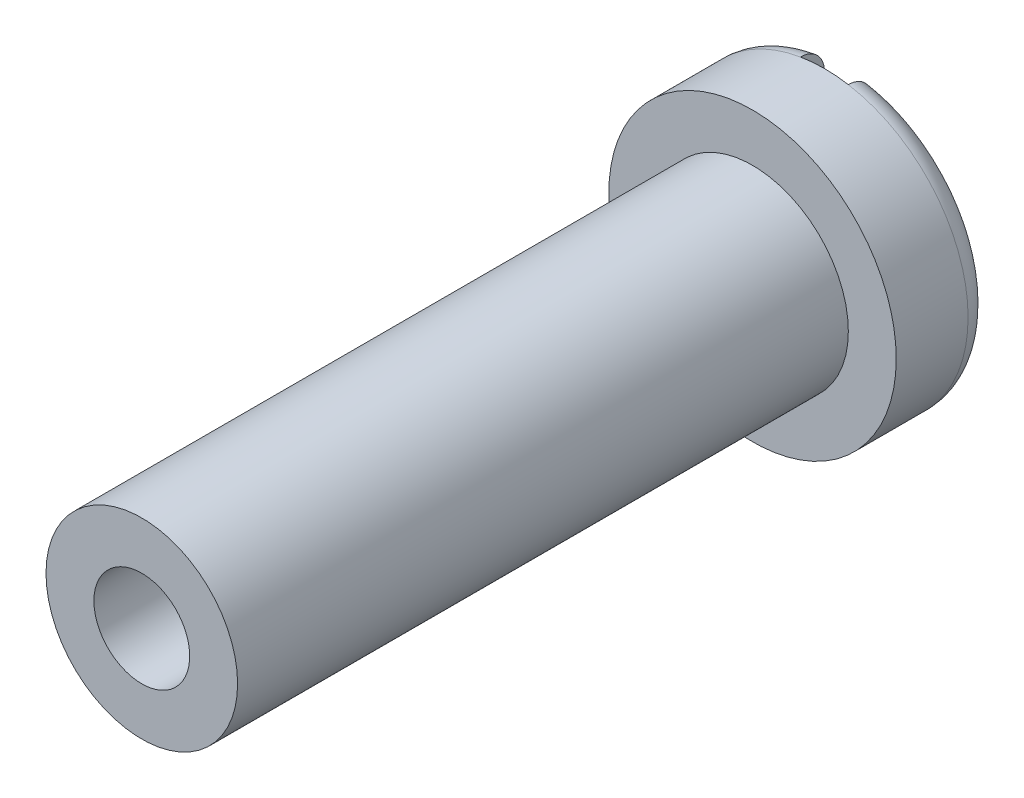
ISO-10303-21;
HEADER;
FILE_DESCRIPTION(('STEP AP214'),'2;1');
FILE_NAME('part.step','',(''),(''),'','','');
FILE_SCHEMA(('AUTOMOTIVE_DESIGN { 1 0 10303 214 1 1 1 1 }'));
ENDSEC;
DATA;
#1=APPLICATION_CONTEXT('core data for automotive mechanical design processes');
#2=APPLICATION_PROTOCOL_DEFINITION('international standard','automotive_design',2000,#1);
#3=PRODUCT_CONTEXT('',#1,'mechanical');
#4=PRODUCT('Part','Part','',(#3));
#5=PRODUCT_RELATED_PRODUCT_CATEGORY('part','',(#4));
#6=PRODUCT_DEFINITION_FORMATION('','',#4);
#7=PRODUCT_DEFINITION_CONTEXT('part definition',#1,'design');
#8=PRODUCT_DEFINITION('design','',#6,#7);
#9=PRODUCT_DEFINITION_SHAPE('','',#8);
#10=(LENGTH_UNIT() NAMED_UNIT(*) SI_UNIT(.MILLI.,.METRE.));
#11=(NAMED_UNIT(*) PLANE_ANGLE_UNIT() SI_UNIT($,.RADIAN.));
#12=(NAMED_UNIT(*) SI_UNIT($,.STERADIAN.) SOLID_ANGLE_UNIT());
#13=UNCERTAINTY_MEASURE_WITH_UNIT(LENGTH_MEASURE(1.E-05),#10,'distance_accuracy_value','');
#14=(GEOMETRIC_REPRESENTATION_CONTEXT(3) GLOBAL_UNCERTAINTY_ASSIGNED_CONTEXT((#13)) GLOBAL_UNIT_ASSIGNED_CONTEXT((#10,
#11,#12)) REPRESENTATION_CONTEXT('',''));
#15=CARTESIAN_POINT('',(0.,0.,0.));
#16=DIRECTION('',(0.,0.,1.));
#17=DIRECTION('',(1.,0.,0.));
#18=AXIS2_PLACEMENT_3D('',#15,#16,#17);
#19=CARTESIAN_POINT('',(0.,0.,0.));
#20=DIRECTION('',(0.,0.,1.));
#21=DIRECTION('',(1.,0.,0.));
#22=AXIS2_PLACEMENT_3D('',#19,#20,#21);
#23=PLANE('',#22);
#24=CARTESIAN_POINT('',(0.,0.,0.));
#25=DIRECTION('',(0.,0.,1.));
#26=DIRECTION('',(1.,0.,0.));
#27=AXIS2_PLACEMENT_3D('',#24,#25,#26);
#28=CIRCLE('',#27,2.5);
#29=CARTESIAN_POINT('',(-0.5,-2.44948974278318,0.));
#30=VERTEX_POINT('',#29);
#31=CARTESIAN_POINT('',(-0.5,2.44948974278318,0.));
#32=VERTEX_POINT('',#31);
#33=EDGE_CURVE('E116',#30,#32,#28,.F.);
#34=ORIENTED_EDGE('',*,*,#33,.T.);
#35=DIRECTION('',(0.,1.,0.));
#36=VECTOR('',#35,1.);
#37=CARTESIAN_POINT('',(-0.5,-3.,0.));
#38=LINE('',#37,#36);
#39=CARTESIAN_POINT('',(-0.5,0.866025403784439,0.));
#40=VERTEX_POINT('',#39);
#41=EDGE_CURVE('E120',#40,#32,#38,.T.);
#42=ORIENTED_EDGE('',*,*,#41,.F.);
#43=CARTESIAN_POINT('',(0.,0.,0.));
#44=DIRECTION('',(0.,0.,1.));
#45=DIRECTION('',(1.,0.,0.));
#46=AXIS2_PLACEMENT_3D('',#43,#44,#45);
#47=CIRCLE('',#46,1.);
#48=CARTESIAN_POINT('',(-0.5,-0.866025403784439,0.));
#49=VERTEX_POINT('',#48);
#50=EDGE_CURVE('E118',#40,#49,#47,.T.);
#51=ORIENTED_EDGE('',*,*,#50,.T.);
#52=EDGE_CURVE('E104',#30,#49,#38,.T.);
#53=ORIENTED_EDGE('',*,*,#52,.F.);
#54=EDGE_LOOP('',(#34,#42,#51,#53));
#55=FACE_BOUND('',#54,.T.);
#56=ADVANCED_FACE('F36',(#55),#23,.F.);
#57=CARTESIAN_POINT('',(0.,0.,0.5));
#58=DIRECTION('',(0.,0.,1.));
#59=DIRECTION('',(1.,0.,0.));
#60=AXIS2_PLACEMENT_3D('',#57,#58,#59);
#61=TOROIDAL_SURFACE('',#60,2.5,0.5);
#62=CARTESIAN_POINT('',(-0.5,-2.86557935103233,0.212211077208372));
#63=CARTESIAN_POINT('',(-0.5,-2.84908343301434,0.189125836637219));
#64=CARTESIAN_POINT('',(-0.5,-2.83060174286954,0.167431666816245));
#65=CARTESIAN_POINT('',(-0.5,-2.79022816381958,0.127452125841192));
#66=CARTESIAN_POINT('',(-0.5,-2.76833162861457,0.109171474766864));
#67=CARTESIAN_POINT('',(-0.5,-2.72181465497284,0.076550773298137));
#68=CARTESIAN_POINT('',(-0.5,-2.69719742039813,0.0622061557964378));
#69=CARTESIAN_POINT('',(-0.5,-2.64593477801213,0.0378010944943139));
#70=CARTESIAN_POINT('',(-0.5,-2.6192898689541,0.0277396011500577));
#71=CARTESIAN_POINT('',(-0.5,-2.56437438937572,0.0120390031683376));
#72=CARTESIAN_POINT('',(-0.5,-2.53608790262562,0.00645558398191359));
#73=CARTESIAN_POINT('',(-0.5,-2.47897983950098,4.02221206146929E-05));
#74=CARTESIAN_POINT('',(-0.5,-2.45015819366419,-0.000791099357594283));
#75=CARTESIAN_POINT('',(-0.5,-2.39234248177718,0.00232260234355144));
#76=CARTESIAN_POINT('',(-0.5,-2.36335224343142,0.00633896413429577));
#77=CARTESIAN_POINT('',(-0.5,-2.30644556567465,0.0191480959799344));
#78=CARTESIAN_POINT('',(-0.5,-2.27852919474786,0.0279411701232567));
#79=CARTESIAN_POINT('',(-0.5,-2.22438259648249,0.0501408933895377));
#80=CARTESIAN_POINT('',(-0.5,-2.19816439201067,0.0635769031347506));
#81=CARTESIAN_POINT('',(-0.5,-2.14838054884301,0.0946967408331416));
#82=CARTESIAN_POINT('',(-0.5,-2.12481486635714,0.112380498645838));
#83=CARTESIAN_POINT('',(-0.5,-2.08125378112858,0.151350967708757));
#84=CARTESIAN_POINT('',(-0.5,-2.06122847265676,0.172604215825871));
#85=CARTESIAN_POINT('',(-0.5,-2.02513834228332,0.218244585056063));
#86=CARTESIAN_POINT('',(-0.5,-2.00907296419208,0.24263126533202));
#87=CARTESIAN_POINT('',(-0.5,-1.98179691972927,0.293208037709745));
#88=CARTESIAN_POINT('',(-0.5,-1.97047619972464,0.31933874925384));
#89=CARTESIAN_POINT('',(-0.5,-1.95252704311308,0.373164498721826));
#90=CARTESIAN_POINT('',(-0.5,-1.94589770203987,0.400859234000106));
#91=CARTESIAN_POINT('',(-0.5,-1.93769106174114,0.456192479972119));
#92=CARTESIAN_POINT('',(-0.5,-1.9359774272899,0.483810828178832));
#93=CARTESIAN_POINT('',(-0.5,-1.93727312260736,0.538934982268315));
#94=CARTESIAN_POINT('',(-0.5,-1.94028203106286,0.566440797970988));
#95=CARTESIAN_POINT('',(-0.5,-1.95085107755539,0.620222466290844));
#96=CARTESIAN_POINT('',(-0.5,-1.95835701114113,0.646509012730186));
#97=CARTESIAN_POINT('',(-0.5,-1.97762003887047,0.697473450370461));
#98=CARTESIAN_POINT('',(-0.5,-1.98937734778054,0.722151260228589));
#99=CARTESIAN_POINT('',(-0.5,-2.01694503925742,0.769556297138164));
#100=CARTESIAN_POINT('',(-0.5,-2.03280603967995,0.792254054924681));
#101=CARTESIAN_POINT('',(-0.5,-2.06801764130369,0.834757191368612));
#102=CARTESIAN_POINT('',(-0.5,-2.08736870523899,0.854562185854722));
#103=CARTESIAN_POINT('',(-0.5,-2.12958310583307,0.891299951367165));
#104=CARTESIAN_POINT('',(-0.5,-2.15252882609535,0.908138060716014));
#105=CARTESIAN_POINT('',(-0.5,-2.20086600859529,0.937833121965905));
#106=CARTESIAN_POINT('',(-0.5,-2.22625779903698,0.950689538641001));
#107=CARTESIAN_POINT('',(-0.5,-2.27944003150595,0.972366765770944));
#108=CARTESIAN_POINT('',(-0.5,-2.30727404721541,0.981080792054572));
#109=CARTESIAN_POINT('',(-0.5,-2.36400381203921,0.993764171042049));
#110=CARTESIAN_POINT('',(-0.5,-2.39289963664407,0.997733185718555));
#111=CARTESIAN_POINT('',(-0.5,-2.45123543303566,1.00082266583561));
#112=CARTESIAN_POINT('',(-0.5,-2.48067796240169,0.999895254806108));
#113=CARTESIAN_POINT('',(-0.5,-2.53898492343792,0.993082405529239));
#114=CARTESIAN_POINT('',(-0.5,-2.56784936319352,0.987197036675621));
#115=CARTESIAN_POINT('',(-0.5,-2.62400009587569,0.970650447848119));
#116=CARTESIAN_POINT('',(-0.5,-2.65129436376057,0.960016321418481));
#117=CARTESIAN_POINT('',(-0.5,-2.70367098158876,0.934249347639978));
#118=CARTESIAN_POINT('',(-0.5,-2.72875348701904,0.919116816856536));
#119=CARTESIAN_POINT('',(-0.5,-2.77559416757801,0.885017700104764));
#120=CARTESIAN_POINT('',(-0.5,-2.79739601384445,0.866111114947838));
#121=CARTESIAN_POINT('',(-0.5,-2.83744954052261,0.824850693128276));
#122=CARTESIAN_POINT('',(-0.5,-2.85570153910537,0.802497165735607));
#123=CARTESIAN_POINT('',(-0.5,-2.88782024937878,0.755375839305717));
#124=CARTESIAN_POINT('',(-0.5,-2.90175437291598,0.73065398126276));
#125=CARTESIAN_POINT('',(-0.5,-2.92521133384927,0.679200344719238));
#126=CARTESIAN_POINT('',(-0.5,-2.93473469281187,0.652468804295422));
#127=CARTESIAN_POINT('',(-0.5,-2.94898192429175,0.59812679388951));
#128=CARTESIAN_POINT('',(-0.5,-2.95376631926432,0.570532177326869));
#129=CARTESIAN_POINT('',(-0.5,-2.95860348679601,0.514923824263358));
#130=CARTESIAN_POINT('',(-0.5,-2.95865525382995,0.486909999959394));
#131=CARTESIAN_POINT('',(-0.5,-2.95403802302186,0.431437702631193));
#132=CARTESIAN_POINT('',(-0.5,-2.94939575133247,0.403976983340473));
#133=CARTESIAN_POINT('',(-0.5,-2.93557355018911,0.35024800224892));
#134=CARTESIAN_POINT('',(-0.5,-2.9263992950881,0.323978294012066));
#135=CARTESIAN_POINT('',(-0.5,-2.90832721399405,0.283480396111857));
#136=CARTESIAN_POINT('',(-0.5,-2.90078235341862,0.268633238677607));
#137=CARTESIAN_POINT('',(-0.5,-2.88424579034659,0.239768252887234));
#138=CARTESIAN_POINT('',(-0.5,-2.87525409819307,0.225750418603442));
#139=CARTESIAN_POINT('',(-0.5,-2.86557935103233,0.212211077208372));
#140=B_SPLINE_CURVE_WITH_KNOTS('',3,(#62,#63,#64,#65,#66,#67,#68,#69,#70,#71,#72,#73,#74,#75,
#76,#77,#78,#79,#80,#81,#82,#83,#84,#85,#86,#87,#88,#89,#90,#91,#92,#93,#94,#95,#96,#97,#98,#99,
#100,#101,#102,#103,#104,#105,#106,#107,#108,#109,#110,#111,#112,#113,#114,#115,#116,#117,#118,
#119,#120,#121,#122,#123,#124,#125,#126,#127,#128,#129,#130,#131,#132,#133,#134,#135,#136,#137,
#138,#139),.UNSPECIFIED.,.T.,.F.,(4,2,2,2,2,2,2,2,2,2,2,2,2,2,2,2,2,2,2,2,2,2,2,2,2,2,2,2,2,2,2,
2,2,2,2,2,2,2,4),(0.,0.0850579470654975,0.170232651786428,0.255308103536921,0.340362696241013,
0.426459232053784,0.512567022192844,0.599957576539753,0.687353694874832,0.775312913759508,
0.863270680326904,0.950445709949068,1.03760848846932,1.12261955723072,1.20761423196182,
1.29022768560206,1.37283376944995,1.45446365426349,1.53609766334567,1.61879106047519,
1.70149542967475,1.78648872849965,1.87149344731546,1.95858432968249,2.04568141590065,
2.13363169118464,2.22158073549847,2.30903428241772,2.39648167644014,2.48263603020255,
2.56878265843162,2.65350732713462,2.73822197470912,2.82184019656225,2.90547618445017,
2.98863864590266,3.07169724518349,3.12158352696465,3.1714694521355),.UNSPECIFIED.);
#141=CARTESIAN_POINT('',(-0.5,-2.95803989154981,0.5));
#142=VERTEX_POINT('',#141);
#143=EDGE_CURVE('E101',#142,#30,#140,.T.);
#144=ORIENTED_EDGE('',*,*,#143,.F.);
#145=CARTESIAN_POINT('',(0.,0.,0.5));
#146=DIRECTION('',(0.,0.,1.));
#147=DIRECTION('',(1.,0.,0.));
#148=AXIS2_PLACEMENT_3D('',#145,#146,#147);
#149=CIRCLE('',#148,3.);
#150=CARTESIAN_POINT('',(-0.5,2.95803989154981,0.5));
#151=VERTEX_POINT('',#150);
#152=EDGE_CURVE('E211',#151,#142,#149,.T.);
#153=ORIENTED_EDGE('',*,*,#152,.F.);
#154=CARTESIAN_POINT('',(-0.5,1.9616253331216,0.345881152870562));
#155=CARTESIAN_POINT('',(-0.5,1.97053716791881,0.319233421878005));
#156=CARTESIAN_POINT('',(-0.5,1.9817562134688,0.293332569929471));
#157=CARTESIAN_POINT('',(-0.5,2.00842697620178,0.243780602160281));
#158=CARTESIAN_POINT('',(-0.5,2.023884997987,0.220132908600045));
#159=CARTESIAN_POINT('',(-0.5,2.05849912360024,0.175785586097364));
#160=CARTESIAN_POINT('',(-0.5,2.07764890354967,0.155081019547823));
#161=CARTESIAN_POINT('',(-0.5,2.11908035249139,0.117105470083519));
#162=CARTESIAN_POINT('',(-0.5,2.14136129361136,0.0998336914264729));
#163=CARTESIAN_POINT('',(-0.5,2.18892702148662,0.0688137221753887));
#164=CARTESIAN_POINT('',(-0.5,2.21426514261652,0.0551473072420906));
#165=CARTESIAN_POINT('',(-0.5,2.26684602637097,0.0321682248234244));
#166=CARTESIAN_POINT('',(-0.5,2.29408908016916,0.0228562246006806));
#167=CARTESIAN_POINT('',(-0.5,2.3502694918255,0.00869250908571221));
#168=CARTESIAN_POINT('',(-0.5,2.37922932613973,0.00392978009239407));
#169=CARTESIAN_POINT('',(-0.5,2.4375387746648,-0.000682539090734759));
#170=CARTESIAN_POINT('',(-0.5,2.4668884025746,-0.000531956147193024));
#171=CARTESIAN_POINT('',(-0.5,2.52522930796159,0.00470765151178798));
#172=CARTESIAN_POINT('',(-0.5,2.55421933582595,0.00981065479232735));
#173=CARTESIAN_POINT('',(-0.5,2.61091390590954,0.0248628900746526));
#174=CARTESIAN_POINT('',(-0.5,2.63861850652495,0.0348119016887241));
#175=CARTESIAN_POINT('',(-0.5,2.69164009838888,0.0591758129142608));
#176=CARTESIAN_POINT('',(-0.5,2.71697898073226,0.073543045404159));
#177=CARTESIAN_POINT('',(-0.5,2.76483123466002,0.106394833229823));
#178=CARTESIAN_POINT('',(-0.5,2.78734484289268,0.124879043362345));
#179=CARTESIAN_POINT('',(-0.5,2.82851381871999,0.165116607944695));
#180=CARTESIAN_POINT('',(-0.5,2.84722622325356,0.18681160401337));
#181=CARTESIAN_POINT('',(-0.5,2.88067421095373,0.233077135064208));
#182=CARTESIAN_POINT('',(-0.5,2.89541014953206,0.257647412775548));
#183=CARTESIAN_POINT('',(-0.5,2.92025179869314,0.308554908157487));
#184=CARTESIAN_POINT('',(-0.5,2.9304256701407,0.334858876053274));
#185=CARTESIAN_POINT('',(-0.5,2.94616113006167,0.388811869620378));
#186=CARTESIAN_POINT('',(-0.5,2.95172301978989,0.416460807313303));
#187=CARTESIAN_POINT('',(-0.5,2.95802986961126,0.47201438853068));
#188=CARTESIAN_POINT('',(-0.5,2.9588236654782,0.499913498052552));
#189=CARTESIAN_POINT('',(-0.5,2.95570083165011,0.555446256283875));
#190=CARTESIAN_POINT('',(-0.5,2.9517843380524,0.583079912639977));
#191=CARTESIAN_POINT('',(-0.5,2.93937883181019,0.637214942045364));
#192=CARTESIAN_POINT('',(-0.5,2.93090321024326,0.663719386998782));
#193=CARTESIAN_POINT('',(-0.5,2.90964329554235,0.714938878446885));
#194=CARTESIAN_POINT('',(-0.5,2.89685895370597,0.73965390471155));
#195=CARTESIAN_POINT('',(-0.5,2.86728918837755,0.786728128605112));
#196=CARTESIAN_POINT('',(-0.5,2.85048468470272,0.809075335401761));
#197=CARTESIAN_POINT('',(-0.5,2.8134020044161,0.850671600441673));
#198=CARTESIAN_POINT('',(-0.5,2.79312366050528,0.869920509385262));
#199=CARTESIAN_POINT('',(-0.5,2.74942238724321,0.905019510802726));
#200=CARTESIAN_POINT('',(-0.5,2.72596562624051,0.920827467307363));
#201=CARTESIAN_POINT('',(-0.5,2.67676433781908,0.948352189997039));
#202=CARTESIAN_POINT('',(-0.5,2.65101963368997,0.960068639827495));
#203=CARTESIAN_POINT('',(-0.5,2.59753690734443,0.979277227574803));
#204=CARTESIAN_POINT('',(-0.5,2.56977369899027,0.986699233379029));
#205=CARTESIAN_POINT('',(-0.5,2.51340299101585,0.996856173304891));
#206=CARTESIAN_POINT('',(-0.5,2.4847954170574,0.999590693479241));
#207=CARTESIAN_POINT('',(-0.5,2.42707018671994,1.00032968547491));
#208=CARTESIAN_POINT('',(-0.5,2.39795156102466,0.998259376985565));
#209=CARTESIAN_POINT('',(-0.5,2.34046295108959,0.989305113768304));
#210=CARTESIAN_POINT('',(-0.5,2.31209302373094,0.982420794390029));
#211=CARTESIAN_POINT('',(-0.5,2.25665148561994,0.963945263491808));
#212=CARTESIAN_POINT('',(-0.5,2.2295934014658,0.952313408427064));
#213=CARTESIAN_POINT('',(-0.5,2.17782629770531,0.924649077616878));
#214=CARTESIAN_POINT('',(-0.5,2.15311729738666,0.908616565743021));
#215=CARTESIAN_POINT('',(-0.5,2.10691673486462,0.872672169636539));
#216=CARTESIAN_POINT('',(-0.5,2.08540837728341,0.852781896294566));
#217=CARTESIAN_POINT('',(-0.5,2.04612829998457,0.809601146223742));
#218=CARTESIAN_POINT('',(-0.5,2.02835599459793,0.786311203403399));
#219=CARTESIAN_POINT('',(-0.5,1.99749193384191,0.737534413593489));
#220=CARTESIAN_POINT('',(-0.5,1.98430506876788,0.71210778321471));
#221=CARTESIAN_POINT('',(-0.5,1.96253064065253,0.659347377103963));
#222=CARTESIAN_POINT('',(-0.5,1.95394339312476,0.632013470686561));
#223=CARTESIAN_POINT('',(-0.5,1.94186056540391,0.577061231009518));
#224=CARTESIAN_POINT('',(-0.5,1.93822720205316,0.549473064193132));
#225=CARTESIAN_POINT('',(-0.5,1.93573736908863,0.494107329510267));
#226=CARTESIAN_POINT('',(-0.5,1.93687421030437,0.46633008136151));
#227=CARTESIAN_POINT('',(-0.5,1.94237370231007,0.423073523402681));
#228=CARTESIAN_POINT('',(-0.5,1.94516264527839,0.407377839892877));
#229=CARTESIAN_POINT('',(-0.5,1.95226235997318,0.37633514839959));
#230=CARTESIAN_POINT('',(-0.5,1.9565730873281,0.360988130263755));
#231=CARTESIAN_POINT('',(-0.5,1.9616253331216,0.345881152870562));
#232=B_SPLINE_CURVE_WITH_KNOTS('',3,(#154,#155,#156,#157,#158,#159,#160,#161,#162,#163,#164,
#165,#166,#167,#168,#169,#170,#171,#172,#173,#174,#175,#176,#177,#178,#179,#180,#181,#182,#183,
#184,#185,#186,#187,#188,#189,#190,#191,#192,#193,#194,#195,#196,#197,#198,#199,#200,#201,#202,
#203,#204,#205,#206,#207,#208,#209,#210,#211,#212,#213,#214,#215,#216,#217,#218,#219,#220,#221,
#222,#223,#224,#225,#226,#227,#228,#229,#230,#231),.UNSPECIFIED.,.T.,.F.,(4,2,2,2,2,2,2,2,2,2,2,
2,2,2,2,2,2,2,2,2,2,2,2,2,2,2,2,2,2,2,2,2,2,2,2,2,2,2,4),(0.,0.0842350880095062,
0.168596144245562,0.25281395615825,0.337012223013596,0.422981892032128,0.508964730573433,
0.596596941380932,0.684232240141123,0.772115617452019,0.859994998358619,0.946957691878443,
1.03391309643223,1.11944752933657,1.20497431474222,1.289176815318,1.37337381535027,
1.45670696199463,1.54003770090016,1.62312500654573,1.70621325137653,1.78970395250722,
1.87319867565439,1.95766453329308,2.0421369203719,2.12795248304293,2.21377562361229,
2.30094341666206,2.38811781318888,2.47605470664862,2.56399232207233,2.65145084872958,
2.73889565501962,2.82440007648014,2.90991036241751,2.99299018856356,3.07595355235404,
3.12370901313797,3.17146308160364),.UNSPECIFIED.);
#233=EDGE_CURVE('E110',#32,#151,#232,.T.);
#234=ORIENTED_EDGE('',*,*,#233,.F.);
#235=ORIENTED_EDGE('',*,*,#33,.F.);
#236=EDGE_LOOP('',(#144,#153,#234,#235));
#237=FACE_BOUND('',#236,.T.);
#238=ADVANCED_FACE('F123',(#237),#61,.T.);
#239=CARTESIAN_POINT('',(0.,0.,2.));
#240=DIRECTION('',(0.,0.,-1.));
#241=DIRECTION('',(-1.,0.,0.));
#242=AXIS2_PLACEMENT_3D('',#239,#240,#241);
#243=CYLINDRICAL_SURFACE('',#242,3.);
#244=CARTESIAN_POINT('',(0.5,2.95803989154981,0.5));
#245=VERTEX_POINT('',#244);
#246=EDGE_CURVE('E132',#245,#151,#149,.T.);
#247=ORIENTED_EDGE('',*,*,#246,.T.);
#248=ORIENTED_EDGE('',*,*,#152,.T.);
#249=CARTESIAN_POINT('',(0.,0.,0.5));
#250=DIRECTION('',(0.,0.,1.));
#251=DIRECTION('',(1.,0.,0.));
#252=AXIS2_PLACEMENT_3D('',#249,#250,#251);
#253=CIRCLE('',#252,3.);
#254=CARTESIAN_POINT('',(0.5,-2.95803989154981,0.5));
#255=VERTEX_POINT('',#254);
#256=EDGE_CURVE('E161',#255,#142,#253,.F.);
#257=ORIENTED_EDGE('',*,*,#256,.F.);
#258=EDGE_CURVE('E207',#255,#245,#149,.T.);
#259=ORIENTED_EDGE('',*,*,#258,.T.);
#260=EDGE_LOOP('',(#247,#248,#257,#259));
#261=FACE_BOUND('',#260,.T.);
#262=CARTESIAN_POINT('',(0.,0.,2.));
#263=DIRECTION('',(0.,0.,1.));
#264=DIRECTION('',(1.,0.,0.));
#265=AXIS2_PLACEMENT_3D('',#262,#263,#264);
#266=CIRCLE('',#265,3.);
#267=CARTESIAN_POINT('',(3.,0.,2.));
#268=VERTEX_POINT('',#267);
#269=EDGE_CURVE('E205',#268,#268,#266,.T.);
#270=ORIENTED_EDGE('',*,*,#269,.F.);
#271=EDGE_LOOP('',(#270));
#272=FACE_BOUND('',#271,.T.);
#273=ADVANCED_FACE('F214',(#261,#272),#243,.T.);
#274=CARTESIAN_POINT('',(0.,0.,2.));
#275=DIRECTION('',(0.,0.,1.));
#276=DIRECTION('',(1.,0.,0.));
#277=AXIS2_PLACEMENT_3D('',#274,#275,#276);
#278=PLANE('',#277);
#279=CARTESIAN_POINT('',(0.,0.,2.));
#280=DIRECTION('',(0.,0.,1.));
#281=DIRECTION('',(1.,0.,0.));
#282=AXIS2_PLACEMENT_3D('',#279,#280,#281);
#283=CIRCLE('',#282,2.);
#284=CARTESIAN_POINT('',(2.,0.,2.));
#285=VERTEX_POINT('',#284);
#286=EDGE_CURVE('E125',#285,#285,#283,.T.);
#287=ORIENTED_EDGE('',*,*,#286,.F.);
#288=EDGE_LOOP('',(#287));
#289=FACE_BOUND('',#288,.T.);
#290=ORIENTED_EDGE('',*,*,#269,.T.);
#291=EDGE_LOOP('',(#290));
#292=FACE_BOUND('',#291,.T.);
#293=ADVANCED_FACE('F235',(#289,#292),#278,.T.);
#294=CARTESIAN_POINT('',(0.5,2.44948974278318,0.));
#295=VERTEX_POINT('',#294);
#296=CARTESIAN_POINT('',(0.5,-2.44948974278318,0.));
#297=VERTEX_POINT('',#296);
#298=EDGE_CURVE('E126',#295,#297,#28,.F.);
#299=ORIENTED_EDGE('',*,*,#298,.T.);
#300=DIRECTION('',(0.,-1.,0.));
#301=VECTOR('',#300,1.);
#302=CARTESIAN_POINT('',(0.5,-3.,0.));
#303=LINE('',#302,#301);
#304=CARTESIAN_POINT('',(0.5,-0.866025403784439,0.));
#305=VERTEX_POINT('',#304);
#306=EDGE_CURVE('E119',#305,#297,#303,.T.);
#307=ORIENTED_EDGE('',*,*,#306,.F.);
#308=CARTESIAN_POINT('',(0.5,0.866025403784439,0.));
#309=VERTEX_POINT('',#308);
#310=EDGE_CURVE('E200',#305,#309,#47,.T.);
#311=ORIENTED_EDGE('',*,*,#310,.T.);
#312=EDGE_CURVE('E166',#295,#309,#303,.T.);
#313=ORIENTED_EDGE('',*,*,#312,.F.);
#314=EDGE_LOOP('',(#299,#307,#311,#313));
#315=FACE_BOUND('',#314,.T.);
#316=ADVANCED_FACE('F224',(#315),#23,.F.);
#317=CARTESIAN_POINT('',(0.5,-2.86557935103233,0.212211077208372));
#318=CARTESIAN_POINT('',(0.5,-2.88176122761781,0.234861185241162));
#319=CARTESIAN_POINT('',(0.5,-2.89605545955607,0.258882854940457));
#320=CARTESIAN_POINT('',(0.5,-2.9204259653997,0.309001157489565));
#321=CARTESIAN_POINT('',(0.5,-2.93049777258709,0.335099953099736));
#322=CARTESIAN_POINT('',(0.5,-2.94610340777798,0.38862010211422));
#323=CARTESIAN_POINT('',(0.5,-2.95163785426377,0.416041274727175));
#324=CARTESIAN_POINT('',(0.5,-2.95799881350318,0.471417874749126));
#325=CARTESIAN_POINT('',(0.5,-2.95882640505644,0.499373178262701));
#326=CARTESIAN_POINT('',(0.5,-2.95575874837886,0.554897282267441));
#327=CARTESIAN_POINT('',(0.5,-2.95188464045747,0.582467253177557));
#328=CARTESIAN_POINT('',(0.5,-2.93956649940168,0.636566688089764));
#329=CARTESIAN_POINT('',(0.5,-2.93112235638065,0.663096127055785));
#330=CARTESIAN_POINT('',(0.5,-2.90990826939103,0.714393695120481));
#331=CARTESIAN_POINT('',(0.5,-2.89713419368628,0.739160114483957));
#332=CARTESIAN_POINT('',(0.5,-2.86764244373568,0.786220335442711));
#333=CARTESIAN_POINT('',(0.5,-2.85092465548945,0.808514065532891));
#334=CARTESIAN_POINT('',(0.5,-2.81387780530256,0.850204263916186));
#335=CARTESIAN_POINT('',(0.5,-2.79351950892485,0.869574744194019));
#336=CARTESIAN_POINT('',(0.5,-2.74987948763064,0.90467984595783));
#337=CARTESIAN_POINT('',(0.5,-2.7265975806891,0.92041424088644));
#338=CARTESIAN_POINT('',(0.5,-2.67742149672219,0.948043119300214));
#339=CARTESIAN_POINT('',(0.5,-2.65149496571867,0.959880003717621));
#340=CARTESIAN_POINT('',(0.5,-2.59804450171786,0.979112655415299));
#341=CARTESIAN_POINT('',(0.5,-2.57052043044536,0.986508037630515));
#342=CARTESIAN_POINT('',(0.5,-2.51417152623088,0.996773301933043));
#343=CARTESIAN_POINT('',(0.5,-2.48533272843739,0.999566551941175));
#344=CARTESIAN_POINT('',(0.5,-2.42759030869696,1.00034011025959));
#345=CARTESIAN_POINT('',(0.5,-2.39868668139489,0.998320005155241));
#346=CARTESIAN_POINT('',(0.5,-2.34123200675124,0.98947772739295));
#347=CARTESIAN_POINT('',(0.5,-2.31269063007061,0.982592602733473));
#348=CARTESIAN_POINT('',(0.5,-2.25716115491617,0.964142024914199));
#349=CARTESIAN_POINT('',(0.5,-2.23017313207936,0.95257634406534));
#350=CARTESIAN_POINT('',(0.5,-2.17846124430164,0.925034231254999));
#351=CARTESIAN_POINT('',(0.5,-2.15374316901642,0.909046916230694));
#352=CARTESIAN_POINT('',(0.5,-2.10738899843186,0.873094694102595));
#353=CARTESIAN_POINT('',(0.5,-2.08575274832242,0.853129986917076));
#354=CARTESIAN_POINT('',(0.5,-2.04652646561924,0.810068539791322));
#355=CARTESIAN_POINT('',(0.5,-2.02888388758353,0.787019710698562));
#356=CARTESIAN_POINT('',(0.5,-1.99784821674221,0.738218310154152));
#357=CARTESIAN_POINT('',(0.5,-1.98445439246523,0.712466205119402));
#358=CARTESIAN_POINT('',(0.5,-1.96269490208284,0.65974869053655));
#359=CARTESIAN_POINT('',(0.5,-1.95420081013896,0.63283629395907));
#360=CARTESIAN_POINT('',(0.5,-1.94198299687051,0.577950457695641));
#361=CARTESIAN_POINT('',(0.5,-1.9382584407897,0.549977204561676));
#362=CARTESIAN_POINT('',(0.5,-1.93574747221265,0.494516797977421));
#363=CARTESIAN_POINT('',(0.5,-1.9368393656844,0.46703508486364));
#364=CARTESIAN_POINT('',(0.5,-1.94364574995046,0.412651881363097));
#365=CARTESIAN_POINT('',(0.5,-1.94936003272891,0.385750364922366));
#366=CARTESIAN_POINT('',(0.5,-1.96517627553924,0.333404694121035));
#367=CARTESIAN_POINT('',(0.5,-1.97525847864042,0.30795455469012));
#368=CARTESIAN_POINT('',(0.5,-1.99947458657449,0.259062931915065));
#369=CARTESIAN_POINT('',(0.5,-2.01360882217207,0.235621612752561));
#370=CARTESIAN_POINT('',(0.5,-2.04579721941586,0.190923386023086));
#371=CARTESIAN_POINT('',(0.5,-2.06392091575893,0.169716588813414));
#372=CARTESIAN_POINT('',(0.5,-2.10338162165372,0.130540729116053));
#373=CARTESIAN_POINT('',(0.5,-2.12471909180993,0.112572131545762));
#374=CARTESIAN_POINT('',(0.5,-2.17065654950039,0.0798460300082348));
#375=CARTESIAN_POINT('',(0.5,-2.19533225416087,0.0651947754059604));
#376=CARTESIAN_POINT('',(0.5,-2.24675506933677,0.0401434124551281));
#377=CARTESIAN_POINT('',(0.5,-2.27350243306822,0.0297438247603818));
#378=CARTESIAN_POINT('',(0.5,-2.3289131727392,0.0132895516880881));
#379=CARTESIAN_POINT('',(0.5,-2.35760491115865,0.00733022544383536));
#380=CARTESIAN_POINT('',(0.5,-2.41558065650381,0.000286356968577446));
#381=CARTESIAN_POINT('',(0.5,-2.44486466803863,-0.000798147311636061));
#382=CARTESIAN_POINT('',(0.5,-2.50334093220584,0.00196242011516133));
#383=CARTESIAN_POINT('',(0.5,-2.53253208632584,0.0058309576316019));
#384=CARTESIAN_POINT('',(0.5,-2.58984550306157,0.0184611991129512));
#385=CARTESIAN_POINT('',(0.5,-2.61796753650776,0.0272239459215554));
#386=CARTESIAN_POINT('',(0.5,-2.67206502189473,0.0493266655273891));
#387=CARTESIAN_POINT('',(0.5,-2.69805696826031,0.0626263023142757));
#388=CARTESIAN_POINT('',(0.5,-2.7473646799367,0.0934610131521486));
#389=CARTESIAN_POINT('',(0.5,-2.77068386120497,0.11099059000438));
#390=CARTESIAN_POINT('',(0.5,-2.80596943386599,0.142629010702434));
#391=CARTESIAN_POINT('',(0.5,-2.81895445335527,0.155620766080218));
#392=CARTESIAN_POINT('',(0.5,-2.84342614680473,0.182946736577082));
#393=CARTESIAN_POINT('',(0.5,-2.85491283730394,0.197280936874833));
#394=CARTESIAN_POINT('',(0.5,-2.86557935103233,0.212211077208372));
#395=B_SPLINE_CURVE_WITH_KNOTS('',3,(#317,#318,#319,#320,#321,#322,#323,#324,#325,#326,#327,
#328,#329,#330,#331,#332,#333,#334,#335,#336,#337,#338,#339,#340,#341,#342,#343,#344,#345,#346,
#347,#348,#349,#350,#351,#352,#353,#354,#355,#356,#357,#358,#359,#360,#361,#362,#363,#364,#365,
#366,#367,#368,#369,#370,#371,#372,#373,#374,#375,#376,#377,#378,#379,#380,#381,#382,#383,#384,
#385,#386,#387,#388,#389,#390,#391,#392,#393,#394),.UNSPECIFIED.,.T.,.F.,(4,2,2,2,2,2,2,2,2,2,2,
2,2,2,2,2,2,2,2,2,2,2,2,2,2,2,2,2,2,2,2,2,2,2,2,2,2,2,4),(0.,0.0834438383657453,
0.166975726921073,0.250496227449289,0.333997584511474,0.417124880332773,0.500254175040906,
0.583463018276982,0.666674267114975,0.750586473138988,0.834503906159572,0.91961100195738,
1.004725475223,1.09124340814802,1.17776877228637,1.26543475332875,1.35310499945931,
1.44099298062573,1.52887654533482,1.61552618594078,1.70216090071733,1.78640749570073,
1.87063934396894,1.95275532165145,2.03486760417246,2.11661229284593,2.19836365618431,
2.28167212805568,2.36499255124543,2.45069032498208,2.53639859001973,2.62389830180805,
2.71139869478587,2.79931517258981,2.88725039052837,2.97442334447126,3.06148361352297,
3.1164874116561,3.17149060258862),.UNSPECIFIED.);
#396=EDGE_CURVE('E159',#297,#255,#395,.T.);
#397=ORIENTED_EDGE('',*,*,#396,.F.);
#398=ORIENTED_EDGE('',*,*,#298,.F.);
#399=CARTESIAN_POINT('',(0.5,1.9616253331216,0.345881152870562));
#400=CARTESIAN_POINT('',(0.5,1.95297505860918,0.371755064194902));
#401=CARTESIAN_POINT('',(0.5,1.94648678379752,0.398370463469895));
#402=CARTESIAN_POINT('',(0.5,1.93807075007985,0.452331865852191));
#403=CARTESIAN_POINT('',(0.5,1.93614732329429,0.479678538086907));
#404=CARTESIAN_POINT('',(0.5,1.936936910059,0.534298513615703));
#405=CARTESIAN_POINT('',(0.5,1.93964851452435,0.561571836684038));
#406=CARTESIAN_POINT('',(0.5,1.94961018265695,0.615269356545908));
#407=CARTESIAN_POINT('',(0.5,1.95685948060875,0.641693695810896));
#408=CARTESIAN_POINT('',(0.5,1.97565720086788,0.69299204990248));
#409=CARTESIAN_POINT('',(0.5,1.98720974584385,0.717864551246618));
#410=CARTESIAN_POINT('',(0.5,2.01423991053688,0.765375333479308));
#411=CARTESIAN_POINT('',(0.5,2.02971800787538,0.788013342031476));
#412=CARTESIAN_POINT('',(0.5,2.06451009173701,0.830953008268648));
#413=CARTESIAN_POINT('',(0.5,2.08390090587585,0.851192383936935));
#414=CARTESIAN_POINT('',(0.5,2.1257218676808,0.888239204591224));
#415=CARTESIAN_POINT('',(0.5,2.14815245060909,0.905046157225579));
#416=CARTESIAN_POINT('',(0.5,2.19610049585218,0.935243665539387));
#417=CARTESIAN_POINT('',(0.5,2.22168733526465,0.948524117898906));
#418=CARTESIAN_POINT('',(0.5,2.27469882279211,0.970691098378712));
#419=CARTESIAN_POINT('',(0.5,2.30212367054078,0.979577148323725));
#420=CARTESIAN_POINT('',(0.5,2.35857657049385,0.992845352589028));
#421=CARTESIAN_POINT('',(0.5,2.3876248235821,0.99714173337766));
#422=CARTESIAN_POINT('',(0.5,2.44603176375656,1.00080907457328));
#423=CARTESIAN_POINT('',(0.5,2.47539046064682,1.00017987896028));
#424=CARTESIAN_POINT('',(0.5,2.5336453587876,0.993984026990985));
#425=CARTESIAN_POINT('',(0.5,2.5625404826729,0.988407201817243));
#426=CARTESIAN_POINT('',(0.5,2.61896537912659,0.97242790978231));
#427=CARTESIAN_POINT('',(0.5,2.646495214235,0.962025664186454));
#428=CARTESIAN_POINT('',(0.5,2.69908069129287,0.936799777438043));
#429=CARTESIAN_POINT('',(0.5,2.72416002345931,0.922025546368528));
#430=CARTESIAN_POINT('',(0.5,2.77142705791471,0.888409674889352));
#431=CARTESIAN_POINT('',(0.5,2.79361500926253,0.869568385181455));
#432=CARTESIAN_POINT('',(0.5,2.83407967600124,0.828685305096956));
#433=CARTESIAN_POINT('',(0.5,2.85241468975615,0.806701216606127));
#434=CARTESIAN_POINT('',(0.5,2.88506485306168,0.759926598261577));
#435=CARTESIAN_POINT('',(0.5,2.89938035737205,0.735136316352129));
#436=CARTESIAN_POINT('',(0.5,2.92335998690308,0.683863212345339));
#437=CARTESIAN_POINT('',(0.5,2.93309197687981,0.657412118229925));
#438=CARTESIAN_POINT('',(0.5,2.94792671641353,0.603242331156481));
#439=CARTESIAN_POINT('',(0.5,2.95302976165792,0.575523719283691));
#440=CARTESIAN_POINT('',(0.5,2.95842190650038,0.519901218152708));
#441=CARTESIAN_POINT('',(0.5,2.95875834479066,0.492001908042908));
#442=CARTESIAN_POINT('',(0.5,2.95472916321715,0.436545512162345));
#443=CARTESIAN_POINT('',(0.5,2.95036367056742,0.408988417153114));
#444=CARTESIAN_POINT('',(0.5,2.93708082206439,0.355069534818568));
#445=CARTESIAN_POINT('',(0.5,2.92817507659002,0.32870488447408));
#446=CARTESIAN_POINT('',(0.5,2.90608589643348,0.277834031649407));
#447=CARTESIAN_POINT('',(0.5,2.89290240367053,0.253327854408066));
#448=CARTESIAN_POINT('',(0.5,2.86256924843554,0.206725996342447));
#449=CARTESIAN_POINT('',(0.5,2.84539929727683,0.184643527425168));
#450=CARTESIAN_POINT('',(0.5,2.80763566015464,0.143632695936418));
#451=CARTESIAN_POINT('',(0.5,2.78704180709888,0.124704487388573));
#452=CARTESIAN_POINT('',(0.5,2.74275810632147,0.0902922463896554));
#453=CARTESIAN_POINT('',(0.5,2.71903430972728,0.0748519141851135));
#454=CARTESIAN_POINT('',(0.5,2.6693635066908,0.0481009196560043));
#455=CARTESIAN_POINT('',(0.5,2.64341632260594,0.0367905876876821));
#456=CARTESIAN_POINT('',(0.5,2.58959240031103,0.0184272491114716));
#457=CARTESIAN_POINT('',(0.5,2.56169142186585,0.0114452965484836));
#458=CARTESIAN_POINT('',(0.5,2.50511956822521,0.0021859103074278));
#459=CARTESIAN_POINT('',(0.5,2.47644862348328,-9.10969432813833E-05));
#460=CARTESIAN_POINT('',(0.5,2.41867654862057,9.81336271464433E-05));
#461=CARTESIAN_POINT('',(0.5,2.38957564884966,0.00263854392228221));
#462=CARTESIAN_POINT('',(0.5,2.33220215302422,0.0125260655109956));
#463=CARTESIAN_POINT('',(0.5,2.30392958562673,0.0198733428986252));
#464=CARTESIAN_POINT('',(0.5,2.24877897093817,0.0392539305758069));
#465=CARTESIAN_POINT('',(0.5,2.2219140978304,0.0513247738629533));
#466=CARTESIAN_POINT('',(0.5,2.17060011825714,0.079835615802426));
#467=CARTESIAN_POINT('',(0.5,2.14615161934975,0.096276709468915));
#468=CARTESIAN_POINT('',(0.5,2.10055036531819,0.13298178063862));
#469=CARTESIAN_POINT('',(0.5,2.07937932353832,0.153223040612634));
#470=CARTESIAN_POINT('',(0.5,2.04085333079812,0.197030833184588));
#471=CARTESIAN_POINT('',(0.5,2.02349324233036,0.22059281786117));
#472=CARTESIAN_POINT('',(0.5,1.99870005501907,0.261267451059733));
#473=CARTESIAN_POINT('',(0.5,1.98995625521919,0.277595639620021));
#474=CARTESIAN_POINT('',(0.5,1.97435201188627,0.31112928021316));
#475=CARTESIAN_POINT('',(0.5,1.96749153173468,0.328334715181452));
#476=CARTESIAN_POINT('',(0.5,1.9616253331216,0.345881152870562));
#477=B_SPLINE_CURVE_WITH_KNOTS('',3,(#399,#400,#401,#402,#403,#404,#405,#406,#407,#408,#409,
#410,#411,#412,#413,#414,#415,#416,#417,#418,#419,#420,#421,#422,#423,#424,#425,#426,#427,#428,
#429,#430,#431,#432,#433,#434,#435,#436,#437,#438,#439,#440,#441,#442,#443,#444,#445,#446,#447,
#448,#449,#450,#451,#452,#453,#454,#455,#456,#457,#458,#459,#460,#461,#462,#463,#464,#465,#466,
#467,#468,#469,#470,#471,#472,#473,#474,#475,#476),.UNSPECIFIED.,.T.,.F.,(4,2,2,2,2,2,2,2,2,2,2,
2,2,2,2,2,2,2,2,2,2,2,2,2,2,2,2,2,2,2,2,2,2,2,2,2,2,2,4),(0.,0.0817781285336233,
0.163633834958755,0.245464661049349,0.327281682275695,0.409177289659992,0.49108286605627,
0.574788533802406,0.658506199988518,0.744592285739497,0.830687736856029,0.918365444231671,
1.00604592885183,1.09390704092682,1.18176412460735,1.26866392557207,1.35555623617319,
1.44102018841869,1.52647659528914,1.61062450958954,1.6947670483167,1.77807334819832,
1.86137739422582,1.94446947495276,2.02756268390304,2.11108843512519,2.19461826374433,
2.27914282923038,2.36367415430549,2.44955873806863,2.53545110554181,2.62267668040761,
2.70990526938094,2.79784152128368,2.88579982738196,2.97324815666321,3.06057786375377,
3.11603692137811,3.17149490060127),.UNSPECIFIED.);
#478=EDGE_CURVE('E168',#245,#295,#477,.T.);
#479=ORIENTED_EDGE('',*,*,#478,.F.);
#480=ORIENTED_EDGE('',*,*,#258,.F.);
#481=EDGE_LOOP('',(#397,#398,#479,#480));
#482=FACE_BOUND('',#481,.T.);
#483=ADVANCED_FACE('F38',(#482),#61,.T.);
#484=CARTESIAN_POINT('',(0.,0.,14.75));
#485=DIRECTION('',(0.,0.,-1.));
#486=DIRECTION('',(-1.,0.,0.));
#487=AXIS2_PLACEMENT_3D('',#484,#485,#486);
#488=CYLINDRICAL_SURFACE('',#487,2.);
#489=CARTESIAN_POINT('',(0.,0.,14.75));
#490=DIRECTION('',(0.,0.,1.));
#491=DIRECTION('',(1.,0.,0.));
#492=AXIS2_PLACEMENT_3D('',#489,#490,#491);
#493=CIRCLE('',#492,2.);
#494=CARTESIAN_POINT('',(2.,0.,14.75));
#495=VERTEX_POINT('',#494);
#496=EDGE_CURVE('E203',#495,#495,#493,.T.);
#497=ORIENTED_EDGE('',*,*,#496,.F.);
#498=EDGE_LOOP('',(#497));
#499=FACE_BOUND('',#498,.T.);
#500=ORIENTED_EDGE('',*,*,#286,.T.);
#501=EDGE_LOOP('',(#500));
#502=FACE_BOUND('',#501,.T.);
#503=ADVANCED_FACE('F227',(#499,#502),#488,.T.);
#504=CARTESIAN_POINT('',(0.,0.,14.75));
#505=DIRECTION('',(0.,0.,1.));
#506=DIRECTION('',(1.,0.,0.));
#507=AXIS2_PLACEMENT_3D('',#504,#505,#506);
#508=PLANE('',#507);
#509=CARTESIAN_POINT('',(0.,0.,14.75));
#510=DIRECTION('',(0.,0.,-1.));
#511=DIRECTION('',(-1.,0.,0.));
#512=AXIS2_PLACEMENT_3D('',#509,#510,#511);
#513=CIRCLE('',#512,1.);
#514=CARTESIAN_POINT('',(-1.,0.,14.75));
#515=VERTEX_POINT('',#514);
#516=EDGE_CURVE('E109',#515,#515,#513,.T.);
#517=ORIENTED_EDGE('',*,*,#516,.T.);
#518=EDGE_LOOP('',(#517));
#519=FACE_BOUND('',#518,.T.);
#520=ORIENTED_EDGE('',*,*,#496,.T.);
#521=EDGE_LOOP('',(#520));
#522=FACE_BOUND('',#521,.T.);
#523=ADVANCED_FACE('F232',(#519,#522),#508,.T.);
#524=CARTESIAN_POINT('',(0.,0.,14.75));
#525=DIRECTION('',(0.,0.,-1.));
#526=DIRECTION('',(-1.,0.,0.));
#527=AXIS2_PLACEMENT_3D('',#524,#525,#526);
#528=CYLINDRICAL_SURFACE('',#527,1.);
#529=CARTESIAN_POINT('',(0.,0.,0.5));
#530=DIRECTION('',(0.,0.,1.));
#531=DIRECTION('',(1.,0.,0.));
#532=AXIS2_PLACEMENT_3D('',#529,#530,#531);
#533=CIRCLE('',#532,1.);
#534=CARTESIAN_POINT('',(0.5,-0.866025403784439,0.5));
#535=VERTEX_POINT('',#534);
#536=CARTESIAN_POINT('',(-0.5,-0.866025403784439,0.5));
#537=VERTEX_POINT('',#536);
#538=EDGE_CURVE('E139',#535,#537,#533,.F.);
#539=ORIENTED_EDGE('',*,*,#538,.T.);
#540=DIRECTION('',(0.,0.,-1.));
#541=VECTOR('',#540,1.);
#542=CARTESIAN_POINT('',(-0.5,-0.866025403784439,14.75));
#543=LINE('',#542,#541);
#544=EDGE_CURVE('E11',#537,#49,#543,.T.);
#545=ORIENTED_EDGE('',*,*,#544,.T.);
#546=ORIENTED_EDGE('',*,*,#50,.F.);
#547=DIRECTION('',(0.,0.,-1.));
#548=VECTOR('',#547,1.);
#549=CARTESIAN_POINT('',(-0.5,0.866025403784439,14.75));
#550=LINE('',#549,#548);
#551=CARTESIAN_POINT('',(-0.5,0.866025403784439,0.5));
#552=VERTEX_POINT('',#551);
#553=EDGE_CURVE('E142',#40,#552,#550,.F.);
#554=ORIENTED_EDGE('',*,*,#553,.T.);
#555=CARTESIAN_POINT('',(0.5,0.866025403784439,0.5));
#556=VERTEX_POINT('',#555);
#557=EDGE_CURVE('E129',#552,#556,#533,.F.);
#558=ORIENTED_EDGE('',*,*,#557,.T.);
#559=DIRECTION('',(0.,0.,-1.));
#560=VECTOR('',#559,1.);
#561=CARTESIAN_POINT('',(0.5,0.866025403784439,14.75));
#562=LINE('',#561,#560);
#563=EDGE_CURVE('E138',#556,#309,#562,.T.);
#564=ORIENTED_EDGE('',*,*,#563,.T.);
#565=ORIENTED_EDGE('',*,*,#310,.F.);
#566=DIRECTION('',(0.,0.,-1.));
#567=VECTOR('',#566,1.);
#568=CARTESIAN_POINT('',(0.5,-0.866025403784439,14.75));
#569=LINE('',#568,#567);
#570=EDGE_CURVE('E45',#305,#535,#569,.F.);
#571=ORIENTED_EDGE('',*,*,#570,.T.);
#572=EDGE_LOOP('',(#539,#545,#546,#554,#558,#564,#565,#571));
#573=FACE_BOUND('',#572,.T.);
#574=ORIENTED_EDGE('',*,*,#516,.F.);
#575=EDGE_LOOP('',(#574));
#576=FACE_BOUND('',#575,.T.);
#577=ADVANCED_FACE('F148',(#573,#576),#528,.F.);
#578=CARTESIAN_POINT('',(0.,0.,0.5));
#579=DIRECTION('',(0.,0.,1.));
#580=DIRECTION('',(1.,0.,0.));
#581=AXIS2_PLACEMENT_3D('',#578,#579,#580);
#582=PLANE('',#581);
#583=DIRECTION('',(0.,1.,0.));
#584=VECTOR('',#583,1.);
#585=CARTESIAN_POINT('',(-0.5,-3.,0.5));
#586=LINE('',#585,#584);
#587=EDGE_CURVE('E162',#552,#151,#586,.T.);
#588=ORIENTED_EDGE('',*,*,#587,.T.);
#589=ORIENTED_EDGE('',*,*,#246,.F.);
#590=DIRECTION('',(0.,-1.,0.));
#591=VECTOR('',#590,1.);
#592=CARTESIAN_POINT('',(0.5,-3.,0.5));
#593=LINE('',#592,#591);
#594=EDGE_CURVE('E60',#245,#556,#593,.T.);
#595=ORIENTED_EDGE('',*,*,#594,.T.);
#596=ORIENTED_EDGE('',*,*,#557,.F.);
#597=EDGE_LOOP('',(#588,#589,#595,#596));
#598=FACE_BOUND('',#597,.T.);
#599=ADVANCED_FACE('F218',(#598),#582,.F.);
#600=CARTESIAN_POINT('',(0.5,-3.,0.5));
#601=DIRECTION('',(1.,0.,0.));
#602=DIRECTION('',(0.,0.,-1.));
#603=AXIS2_PLACEMENT_3D('',#600,#601,#602);
#604=PLANE('',#603);
#605=ORIENTED_EDGE('',*,*,#478,.T.);
#606=ORIENTED_EDGE('',*,*,#312,.T.);
#607=ORIENTED_EDGE('',*,*,#563,.F.);
#608=ORIENTED_EDGE('',*,*,#594,.F.);
#609=EDGE_LOOP('',(#605,#606,#607,#608));
#610=FACE_BOUND('',#609,.T.);
#611=ADVANCED_FACE('F182',(#610),#604,.F.);
#612=CARTESIAN_POINT('',(-0.5,-3.,0.5));
#613=DIRECTION('',(-1.,0.,0.));
#614=DIRECTION('',(0.,0.,1.));
#615=AXIS2_PLACEMENT_3D('',#612,#613,#614);
#616=PLANE('',#615);
#617=ORIENTED_EDGE('',*,*,#233,.T.);
#618=ORIENTED_EDGE('',*,*,#587,.F.);
#619=ORIENTED_EDGE('',*,*,#553,.F.);
#620=ORIENTED_EDGE('',*,*,#41,.T.);
#621=EDGE_LOOP('',(#617,#618,#619,#620));
#622=FACE_BOUND('',#621,.T.);
#623=ADVANCED_FACE('F183',(#622),#616,.F.);
#624=ORIENTED_EDGE('',*,*,#143,.T.);
#625=ORIENTED_EDGE('',*,*,#52,.T.);
#626=ORIENTED_EDGE('',*,*,#544,.F.);
#627=EDGE_CURVE('E52',#142,#537,#586,.T.);
#628=ORIENTED_EDGE('',*,*,#627,.F.);
#629=EDGE_LOOP('',(#624,#625,#626,#628));
#630=FACE_BOUND('',#629,.T.);
#631=ADVANCED_FACE('F103',(#630),#616,.F.);
#632=ORIENTED_EDGE('',*,*,#396,.T.);
#633=EDGE_CURVE('E153',#535,#255,#593,.T.);
#634=ORIENTED_EDGE('',*,*,#633,.F.);
#635=ORIENTED_EDGE('',*,*,#570,.F.);
#636=ORIENTED_EDGE('',*,*,#306,.T.);
#637=EDGE_LOOP('',(#632,#634,#635,#636));
#638=FACE_BOUND('',#637,.T.);
#639=ADVANCED_FACE('F156',(#638),#604,.F.);
#640=ORIENTED_EDGE('',*,*,#256,.T.);
#641=ORIENTED_EDGE('',*,*,#627,.T.);
#642=ORIENTED_EDGE('',*,*,#538,.F.);
#643=ORIENTED_EDGE('',*,*,#633,.T.);
#644=EDGE_LOOP('',(#640,#641,#642,#643));
#645=FACE_BOUND('',#644,.T.);
#646=ADVANCED_FACE('F152',(#645),#582,.F.);
#647=CLOSED_SHELL('',(#56,#238,#273,#293,#316,#483,#503,#523,#577,#599,#611,#623,#631,#639,#646));
#648=MANIFOLD_SOLID_BREP('B2',#647);
#649=ADVANCED_BREP_SHAPE_REPRESENTATION('',(#18,#648),#14);
#650=SHAPE_DEFINITION_REPRESENTATION(#9,#649);
ENDSEC;
END-ISO-10303-21;
